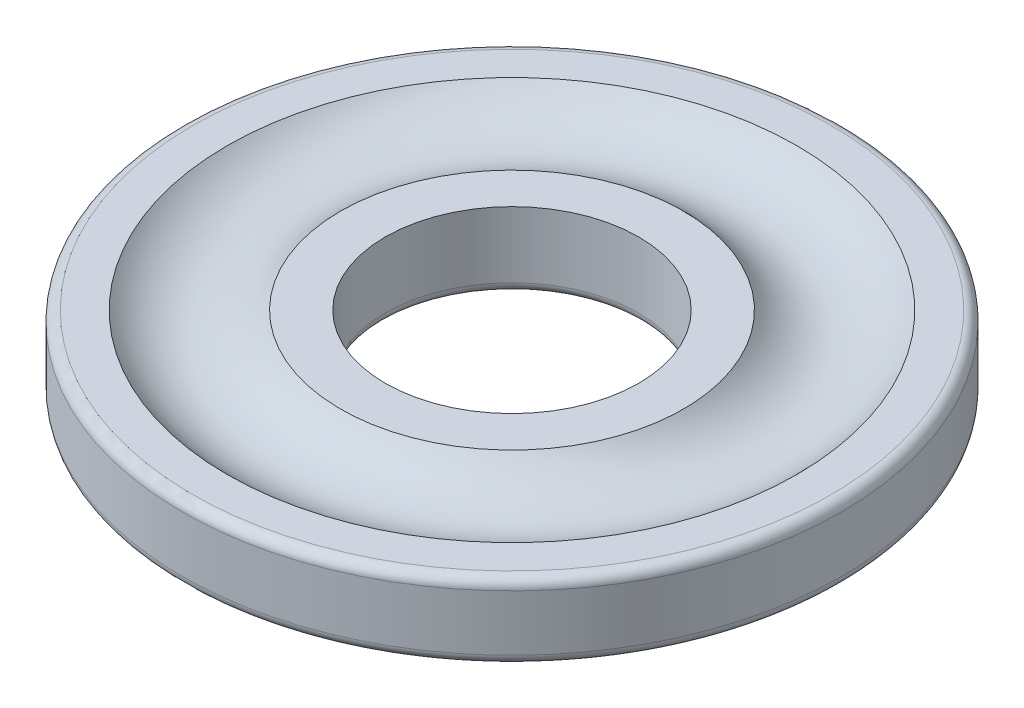
ISO-10303-21;
HEADER;
FILE_DESCRIPTION(('STEP AP214'),'2;1');
FILE_NAME('part.step','',(''),(''),'','','');
FILE_SCHEMA(('AUTOMOTIVE_DESIGN { 1 0 10303 214 1 1 1 1 }'));
ENDSEC;
DATA;
#1=APPLICATION_CONTEXT('core data for automotive mechanical design processes');
#2=APPLICATION_PROTOCOL_DEFINITION('international standard','automotive_design',2000,#1);
#3=PRODUCT_CONTEXT('',#1,'mechanical');
#4=PRODUCT('Part','Part','',(#3));
#5=PRODUCT_RELATED_PRODUCT_CATEGORY('part','',(#4));
#6=PRODUCT_DEFINITION_FORMATION('','',#4);
#7=PRODUCT_DEFINITION_CONTEXT('part definition',#1,'design');
#8=PRODUCT_DEFINITION('design','',#6,#7);
#9=PRODUCT_DEFINITION_SHAPE('','',#8);
#10=(LENGTH_UNIT() NAMED_UNIT(*) SI_UNIT(.MILLI.,.METRE.));
#11=(NAMED_UNIT(*) PLANE_ANGLE_UNIT() SI_UNIT($,.RADIAN.));
#12=(NAMED_UNIT(*) SI_UNIT($,.STERADIAN.) SOLID_ANGLE_UNIT());
#13=UNCERTAINTY_MEASURE_WITH_UNIT(LENGTH_MEASURE(1.E-05),#10,'distance_accuracy_value','');
#14=(GEOMETRIC_REPRESENTATION_CONTEXT(3) GLOBAL_UNCERTAINTY_ASSIGNED_CONTEXT((#13)) GLOBAL_UNIT_ASSIGNED_CONTEXT((#10,
#11,#12)) REPRESENTATION_CONTEXT('',''));
#15=CARTESIAN_POINT('',(0.,0.,0.));
#16=DIRECTION('',(0.,0.,1.));
#17=DIRECTION('',(1.,0.,0.));
#18=AXIS2_PLACEMENT_3D('',#15,#16,#17);
#19=CARTESIAN_POINT('',(0.,0.,0.));
#20=DIRECTION('',(0.,1.,0.));
#21=DIRECTION('',(-1.,0.,0.));
#22=AXIS2_PLACEMENT_3D('',#19,#20,#21);
#23=TOROIDAL_SURFACE('',#22,9.,3.);
#24=CARTESIAN_POINT('',(0.,-2.,0.));
#25=DIRECTION('',(0.,1.,0.));
#26=DIRECTION('',(-1.,0.,0.));
#27=AXIS2_PLACEMENT_3D('',#24,#25,#26);
#28=CIRCLE('',#27,11.2360679774998);
#29=CARTESIAN_POINT('',(-11.2360679774998,-2.,0.));
#30=VERTEX_POINT('',#29);
#31=EDGE_CURVE('E73',#30,#30,#28,.T.);
#32=ORIENTED_EDGE('',*,*,#31,.T.);
#33=EDGE_LOOP('',(#32));
#34=FACE_BOUND('',#33,.T.);
#35=CARTESIAN_POINT('',(0.,-2.,0.));
#36=DIRECTION('',(0.,1.,0.));
#37=DIRECTION('',(-1.,0.,0.));
#38=AXIS2_PLACEMENT_3D('',#35,#36,#37);
#39=CIRCLE('',#38,6.76393202250021);
#40=CARTESIAN_POINT('',(-6.76393202250021,-2.,0.));
#41=VERTEX_POINT('',#40);
#42=EDGE_CURVE('E67',#41,#41,#39,.T.);
#43=ORIENTED_EDGE('',*,*,#42,.F.);
#44=EDGE_LOOP('',(#43));
#45=FACE_BOUND('',#44,.T.);
#46=ADVANCED_FACE('F41',(#34,#45),#23,.F.);
#47=CARTESIAN_POINT('',(0.,-2.,0.));
#48=DIRECTION('',(0.,1.,0.));
#49=DIRECTION('',(-1.,0.,0.));
#50=AXIS2_PLACEMENT_3D('',#47,#48,#49);
#51=PLANE('',#50);
#52=ORIENTED_EDGE('',*,*,#42,.T.);
#53=EDGE_LOOP('',(#52));
#54=FACE_BOUND('',#53,.T.);
#55=CARTESIAN_POINT('',(0.,-2.,0.));
#56=DIRECTION('',(0.,1.,0.));
#57=DIRECTION('',(-1.,0.,0.));
#58=AXIS2_PLACEMENT_3D('',#55,#56,#57);
#59=CIRCLE('',#58,5.);
#60=CARTESIAN_POINT('',(-5.,-2.,0.));
#61=VERTEX_POINT('',#60);
#62=EDGE_CURVE('E70',#61,#61,#59,.T.);
#63=ORIENTED_EDGE('',*,*,#62,.F.);
#64=EDGE_LOOP('',(#63));
#65=FACE_BOUND('',#64,.T.);
#66=ADVANCED_FACE('F95',(#54,#65),#51,.T.);
#67=CARTESIAN_POINT('',(0.,5.,0.));
#68=DIRECTION('',(0.,1.,0.));
#69=DIRECTION('',(-1.,0.,0.));
#70=AXIS2_PLACEMENT_3D('',#67,#68,#69);
#71=CYLINDRICAL_SURFACE('',#70,5.);
#72=CARTESIAN_POINT('',(0.,-4.6,0.));
#73=DIRECTION('',(0.,1.,0.));
#74=DIRECTION('',(-1.,0.,0.));
#75=AXIS2_PLACEMENT_3D('',#72,#73,#74);
#76=CIRCLE('',#75,5.);
#77=CARTESIAN_POINT('',(-5.,-4.6,0.));
#78=VERTEX_POINT('',#77);
#79=EDGE_CURVE('E10',#78,#78,#76,.F.);
#80=ORIENTED_EDGE('',*,*,#79,.T.);
#81=EDGE_LOOP('',(#80));
#82=FACE_BOUND('',#81,.T.);
#83=ORIENTED_EDGE('',*,*,#62,.T.);
#84=EDGE_LOOP('',(#83));
#85=FACE_BOUND('',#84,.T.);
#86=ADVANCED_FACE('F100',(#82,#85),#71,.F.);
#87=CARTESIAN_POINT('',(0.,-5.,0.));
#88=DIRECTION('',(0.,1.,0.));
#89=DIRECTION('',(-1.,0.,0.));
#90=AXIS2_PLACEMENT_3D('',#87,#88,#89);
#91=PLANE('',#90);
#92=CARTESIAN_POINT('',(0.,-5.,0.));
#93=DIRECTION('',(0.,1.,0.));
#94=DIRECTION('',(-1.,0.,0.));
#95=AXIS2_PLACEMENT_3D('',#92,#93,#94);
#96=CIRCLE('',#95,12.6);
#97=CARTESIAN_POINT('',(-12.6,-5.00000000000001,0.));
#98=VERTEX_POINT('',#97);
#99=EDGE_CURVE('E52',#98,#98,#96,.F.);
#100=ORIENTED_EDGE('',*,*,#99,.T.);
#101=EDGE_LOOP('',(#100));
#102=FACE_BOUND('',#101,.T.);
#103=CARTESIAN_POINT('',(0.,-5.,0.));
#104=DIRECTION('',(0.,1.,0.));
#105=DIRECTION('',(-1.,0.,0.));
#106=AXIS2_PLACEMENT_3D('',#103,#104,#105);
#107=CIRCLE('',#106,5.4);
#108=CARTESIAN_POINT('',(-5.4,-5.,0.));
#109=VERTEX_POINT('',#108);
#110=EDGE_CURVE('E56',#109,#109,#107,.T.);
#111=ORIENTED_EDGE('',*,*,#110,.T.);
#112=EDGE_LOOP('',(#111));
#113=FACE_BOUND('',#112,.T.);
#114=ADVANCED_FACE('F91',(#102,#113),#91,.F.);
#115=CARTESIAN_POINT('',(0.,5.,0.));
#116=DIRECTION('',(0.,1.,0.));
#117=DIRECTION('',(-1.,0.,0.));
#118=AXIS2_PLACEMENT_3D('',#115,#116,#117);
#119=CYLINDRICAL_SURFACE('',#118,13.);
#120=CARTESIAN_POINT('',(0.,-4.6,0.));
#121=DIRECTION('',(0.,1.,0.));
#122=DIRECTION('',(-1.,0.,0.));
#123=AXIS2_PLACEMENT_3D('',#120,#121,#122);
#124=CIRCLE('',#123,13.);
#125=CARTESIAN_POINT('',(-13.,-4.60000000000001,0.));
#126=VERTEX_POINT('',#125);
#127=EDGE_CURVE('E61',#126,#126,#124,.T.);
#128=ORIENTED_EDGE('',*,*,#127,.T.);
#129=EDGE_LOOP('',(#128));
#130=FACE_BOUND('',#129,.T.);
#131=CARTESIAN_POINT('',(0.,-2.4,0.));
#132=DIRECTION('',(0.,1.,0.));
#133=DIRECTION('',(-1.,0.,0.));
#134=AXIS2_PLACEMENT_3D('',#131,#132,#133);
#135=CIRCLE('',#134,13.);
#136=CARTESIAN_POINT('',(-13.,-2.4,0.));
#137=VERTEX_POINT('',#136);
#138=EDGE_CURVE('E64',#137,#137,#135,.F.);
#139=ORIENTED_EDGE('',*,*,#138,.T.);
#140=EDGE_LOOP('',(#139));
#141=FACE_BOUND('',#140,.T.);
#142=ADVANCED_FACE('F82',(#130,#141),#119,.T.);
#143=CARTESIAN_POINT('',(0.,-2.,0.));
#144=DIRECTION('',(0.,1.,0.));
#145=DIRECTION('',(-1.,0.,0.));
#146=AXIS2_PLACEMENT_3D('',#143,#144,#145);
#147=PLANE('',#146);
#148=CARTESIAN_POINT('',(0.,-2.,0.));
#149=DIRECTION('',(0.,1.,0.));
#150=DIRECTION('',(-1.,0.,0.));
#151=AXIS2_PLACEMENT_3D('',#148,#149,#150);
#152=CIRCLE('',#151,12.6);
#153=CARTESIAN_POINT('',(-12.6,-2.,0.));
#154=VERTEX_POINT('',#153);
#155=EDGE_CURVE('E48',#154,#154,#152,.T.);
#156=ORIENTED_EDGE('',*,*,#155,.T.);
#157=EDGE_LOOP('',(#156));
#158=FACE_BOUND('',#157,.T.);
#159=ORIENTED_EDGE('',*,*,#31,.F.);
#160=EDGE_LOOP('',(#159));
#161=FACE_BOUND('',#160,.T.);
#162=ADVANCED_FACE('F79',(#158,#161),#147,.T.);
#163=CARTESIAN_POINT('',(0.,-4.6,0.));
#164=DIRECTION('',(0.,1.,0.));
#165=DIRECTION('',(-1.,0.,0.));
#166=AXIS2_PLACEMENT_3D('',#163,#164,#165);
#167=TOROIDAL_SURFACE('',#166,12.6,0.4);
#168=ORIENTED_EDGE('',*,*,#99,.F.);
#169=EDGE_LOOP('',(#168));
#170=FACE_BOUND('',#169,.T.);
#171=ORIENTED_EDGE('',*,*,#127,.F.);
#172=EDGE_LOOP('',(#171));
#173=FACE_BOUND('',#172,.T.);
#174=ADVANCED_FACE('F81',(#170,#173),#167,.T.);
#175=CARTESIAN_POINT('',(0.,-2.4,0.));
#176=DIRECTION('',(0.,1.,0.));
#177=DIRECTION('',(-1.,0.,0.));
#178=AXIS2_PLACEMENT_3D('',#175,#176,#177);
#179=TOROIDAL_SURFACE('',#178,12.6,0.4);
#180=ORIENTED_EDGE('',*,*,#138,.F.);
#181=EDGE_LOOP('',(#180));
#182=FACE_BOUND('',#181,.T.);
#183=ORIENTED_EDGE('',*,*,#155,.F.);
#184=EDGE_LOOP('',(#183));
#185=FACE_BOUND('',#184,.T.);
#186=ADVANCED_FACE('F88',(#182,#185),#179,.T.);
#187=CARTESIAN_POINT('',(0.,-4.6,0.));
#188=DIRECTION('',(0.,1.,0.));
#189=DIRECTION('',(-1.,0.,0.));
#190=AXIS2_PLACEMENT_3D('',#187,#188,#189);
#191=TOROIDAL_SURFACE('',#190,5.4,0.4);
#192=ORIENTED_EDGE('',*,*,#79,.F.);
#193=EDGE_LOOP('',(#192));
#194=FACE_BOUND('',#193,.T.);
#195=ORIENTED_EDGE('',*,*,#110,.F.);
#196=EDGE_LOOP('',(#195));
#197=FACE_BOUND('',#196,.T.);
#198=ADVANCED_FACE('F43',(#194,#197),#191,.T.);
#199=CLOSED_SHELL('',(#46,#66,#86,#114,#142,#162,#174,#186,#198));
#200=MANIFOLD_SOLID_BREP('B2',#199);
#201=ADVANCED_BREP_SHAPE_REPRESENTATION('',(#18,#200),#14);
#202=SHAPE_DEFINITION_REPRESENTATION(#9,#201);
ENDSEC;
END-ISO-10303-21;
